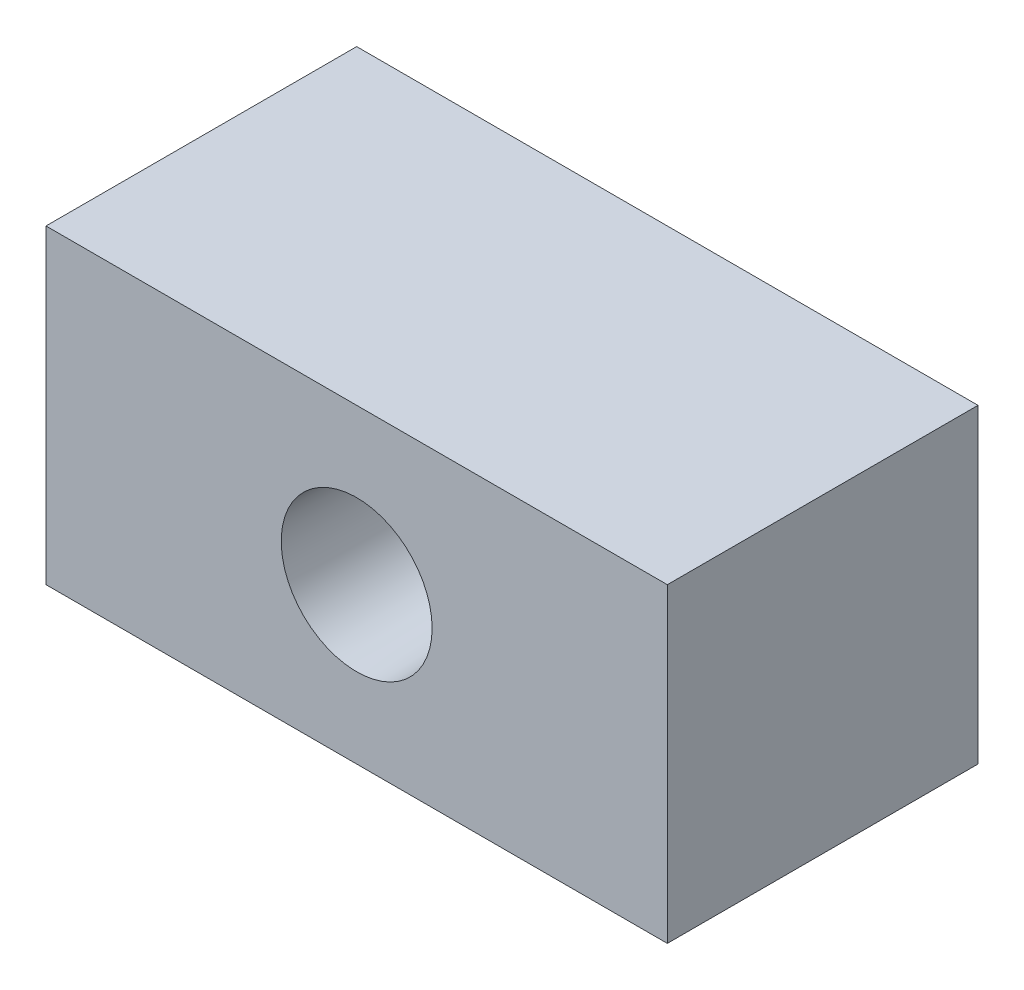
ISO-10303-21;
HEADER;
FILE_DESCRIPTION(('STEP AP214'),'2;1');
FILE_NAME('part.step','',(''),(''),'','','');
FILE_SCHEMA(('AUTOMOTIVE_DESIGN { 1 0 10303 214 1 1 1 1 }'));
ENDSEC;
DATA;
#1=APPLICATION_CONTEXT('core data for automotive mechanical design processes');
#2=APPLICATION_PROTOCOL_DEFINITION('international standard','automotive_design',2000,#1);
#3=PRODUCT_CONTEXT('',#1,'mechanical');
#4=PRODUCT('Part','Part','',(#3));
#5=PRODUCT_RELATED_PRODUCT_CATEGORY('part','',(#4));
#6=PRODUCT_DEFINITION_FORMATION('','',#4);
#7=PRODUCT_DEFINITION_CONTEXT('part definition',#1,'design');
#8=PRODUCT_DEFINITION('design','',#6,#7);
#9=PRODUCT_DEFINITION_SHAPE('','',#8);
#10=(LENGTH_UNIT() NAMED_UNIT(*) SI_UNIT(.MILLI.,.METRE.));
#11=(NAMED_UNIT(*) PLANE_ANGLE_UNIT() SI_UNIT($,.RADIAN.));
#12=(NAMED_UNIT(*) SI_UNIT($,.STERADIAN.) SOLID_ANGLE_UNIT());
#13=UNCERTAINTY_MEASURE_WITH_UNIT(LENGTH_MEASURE(1.E-05),#10,'distance_accuracy_value','');
#14=(GEOMETRIC_REPRESENTATION_CONTEXT(3) GLOBAL_UNCERTAINTY_ASSIGNED_CONTEXT((#13)) GLOBAL_UNIT_ASSIGNED_CONTEXT((#10,
#11,#12)) REPRESENTATION_CONTEXT('',''));
#15=CARTESIAN_POINT('',(0.,0.,0.));
#16=DIRECTION('',(0.,0.,1.));
#17=DIRECTION('',(1.,0.,0.));
#18=AXIS2_PLACEMENT_3D('',#15,#16,#17);
#19=CARTESIAN_POINT('',(-7.,-3.5,7.));
#20=DIRECTION('',(1.,0.,0.));
#21=DIRECTION('',(0.,0.,-1.));
#22=AXIS2_PLACEMENT_3D('',#19,#20,#21);
#23=PLANE('',#22);
#24=DIRECTION('',(0.,-1.,0.));
#25=VECTOR('',#24,1.);
#26=CARTESIAN_POINT('',(-7.,-3.5,0.));
#27=LINE('',#26,#25);
#28=CARTESIAN_POINT('',(-7.,3.5,0.));
#29=VERTEX_POINT('',#28);
#30=CARTESIAN_POINT('',(-7.,-3.5,0.));
#31=VERTEX_POINT('',#30);
#32=EDGE_CURVE('E98',#29,#31,#27,.T.);
#33=ORIENTED_EDGE('',*,*,#32,.T.);
#34=DIRECTION('',(0.,0.,-1.));
#35=VECTOR('',#34,1.);
#36=CARTESIAN_POINT('',(-7.,-3.5,7.));
#37=LINE('',#36,#35);
#38=CARTESIAN_POINT('',(-7.,-3.5,7.));
#39=VERTEX_POINT('',#38);
#40=EDGE_CURVE('E11',#39,#31,#37,.T.);
#41=ORIENTED_EDGE('',*,*,#40,.F.);
#42=DIRECTION('',(0.,-1.,0.));
#43=VECTOR('',#42,1.);
#44=CARTESIAN_POINT('',(-7.,-3.5,7.));
#45=LINE('',#44,#43);
#46=CARTESIAN_POINT('',(-7.,3.5,7.));
#47=VERTEX_POINT('',#46);
#48=EDGE_CURVE('E86',#47,#39,#45,.T.);
#49=ORIENTED_EDGE('',*,*,#48,.F.);
#50=DIRECTION('',(0.,0.,-1.));
#51=VECTOR('',#50,1.);
#52=CARTESIAN_POINT('',(-7.,3.5,7.));
#53=LINE('',#52,#51);
#54=EDGE_CURVE('E94',#47,#29,#53,.T.);
#55=ORIENTED_EDGE('',*,*,#54,.T.);
#56=EDGE_LOOP('',(#33,#41,#49,#55));
#57=FACE_BOUND('',#56,.T.);
#58=ADVANCED_FACE('F35',(#57),#23,.F.);
#59=CARTESIAN_POINT('',(7.,-3.5,7.));
#60=DIRECTION('',(0.,1.,0.));
#61=DIRECTION('',(0.,0.,1.));
#62=AXIS2_PLACEMENT_3D('',#59,#60,#61);
#63=PLANE('',#62);
#64=DIRECTION('',(1.,0.,0.));
#65=VECTOR('',#64,1.);
#66=CARTESIAN_POINT('',(7.,-3.5,0.));
#67=LINE('',#66,#65);
#68=CARTESIAN_POINT('',(7.,-3.5,0.));
#69=VERTEX_POINT('',#68);
#70=EDGE_CURVE('E90',#31,#69,#67,.T.);
#71=ORIENTED_EDGE('',*,*,#70,.T.);
#72=DIRECTION('',(0.,0.,-1.));
#73=VECTOR('',#72,1.);
#74=CARTESIAN_POINT('',(7.,-3.5,7.));
#75=LINE('',#74,#73);
#76=CARTESIAN_POINT('',(7.,-3.5,7.));
#77=VERTEX_POINT('',#76);
#78=EDGE_CURVE('E43',#77,#69,#75,.T.);
#79=ORIENTED_EDGE('',*,*,#78,.F.);
#80=DIRECTION('',(1.,0.,0.));
#81=VECTOR('',#80,1.);
#82=CARTESIAN_POINT('',(7.,-3.5,7.));
#83=LINE('',#82,#81);
#84=EDGE_CURVE('E81',#39,#77,#83,.T.);
#85=ORIENTED_EDGE('',*,*,#84,.F.);
#86=ORIENTED_EDGE('',*,*,#40,.T.);
#87=EDGE_LOOP('',(#71,#79,#85,#86));
#88=FACE_BOUND('',#87,.T.);
#89=ADVANCED_FACE('F89',(#88),#63,.F.);
#90=CARTESIAN_POINT('',(7.,-3.5,7.));
#91=DIRECTION('',(-1.,0.,0.));
#92=DIRECTION('',(0.,-1.,0.));
#93=AXIS2_PLACEMENT_3D('',#90,#91,#92);
#94=PLANE('',#93);
#95=DIRECTION('',(0.,1.,0.));
#96=VECTOR('',#95,1.);
#97=CARTESIAN_POINT('',(7.,-3.5,0.));
#98=LINE('',#97,#96);
#99=CARTESIAN_POINT('',(6.99999999999999,3.5,0.));
#100=VERTEX_POINT('',#99);
#101=EDGE_CURVE('E68',#69,#100,#98,.T.);
#102=ORIENTED_EDGE('',*,*,#101,.T.);
#103=DIRECTION('',(0.,0.,-1.));
#104=VECTOR('',#103,1.);
#105=CARTESIAN_POINT('',(6.99999999999999,3.5,7.));
#106=LINE('',#105,#104);
#107=CARTESIAN_POINT('',(6.99999999999999,3.5,7.));
#108=VERTEX_POINT('',#107);
#109=EDGE_CURVE('E91',#108,#100,#106,.T.);
#110=ORIENTED_EDGE('',*,*,#109,.F.);
#111=DIRECTION('',(0.,1.,0.));
#112=VECTOR('',#111,1.);
#113=CARTESIAN_POINT('',(7.,-3.5,7.));
#114=LINE('',#113,#112);
#115=EDGE_CURVE('E84',#77,#108,#114,.T.);
#116=ORIENTED_EDGE('',*,*,#115,.F.);
#117=ORIENTED_EDGE('',*,*,#78,.T.);
#118=EDGE_LOOP('',(#102,#110,#116,#117));
#119=FACE_BOUND('',#118,.T.);
#120=ADVANCED_FACE('F92',(#119),#94,.F.);
#121=CARTESIAN_POINT('',(6.99999999999999,3.5,7.));
#122=DIRECTION('',(0.,-1.,0.));
#123=DIRECTION('',(0.,0.,-1.));
#124=AXIS2_PLACEMENT_3D('',#121,#122,#123);
#125=PLANE('',#124);
#126=DIRECTION('',(-1.,0.,0.));
#127=VECTOR('',#126,1.);
#128=CARTESIAN_POINT('',(6.99999999999999,3.5,0.));
#129=LINE('',#128,#127);
#130=EDGE_CURVE('E74',#100,#29,#129,.T.);
#131=ORIENTED_EDGE('',*,*,#130,.T.);
#132=ORIENTED_EDGE('',*,*,#54,.F.);
#133=DIRECTION('',(-1.,0.,0.));
#134=VECTOR('',#133,1.);
#135=CARTESIAN_POINT('',(6.99999999999999,3.5,7.));
#136=LINE('',#135,#134);
#137=EDGE_CURVE('E51',#108,#47,#136,.T.);
#138=ORIENTED_EDGE('',*,*,#137,.F.);
#139=ORIENTED_EDGE('',*,*,#109,.T.);
#140=EDGE_LOOP('',(#131,#132,#138,#139));
#141=FACE_BOUND('',#140,.T.);
#142=ADVANCED_FACE('F106',(#141),#125,.F.);
#143=CARTESIAN_POINT('',(0.,0.,7.));
#144=DIRECTION('',(0.,0.,1.));
#145=DIRECTION('',(1.,0.,0.));
#146=AXIS2_PLACEMENT_3D('',#143,#144,#145);
#147=PLANE('',#146);
#148=CARTESIAN_POINT('',(0.,0.,7.));
#149=DIRECTION('',(0.,0.,1.));
#150=DIRECTION('',(1.,0.,0.));
#151=AXIS2_PLACEMENT_3D('',#148,#149,#150);
#152=CIRCLE('',#151,1.7);
#153=CARTESIAN_POINT('',(1.7,0.,7.));
#154=VERTEX_POINT('',#153);
#155=EDGE_CURVE('E114',#154,#154,#152,.T.);
#156=ORIENTED_EDGE('',*,*,#155,.F.);
#157=EDGE_LOOP('',(#156));
#158=FACE_BOUND('',#157,.T.);
#159=ORIENTED_EDGE('',*,*,#48,.T.);
#160=ORIENTED_EDGE('',*,*,#84,.T.);
#161=ORIENTED_EDGE('',*,*,#115,.T.);
#162=ORIENTED_EDGE('',*,*,#137,.T.);
#163=EDGE_LOOP('',(#159,#160,#161,#162));
#164=FACE_BOUND('',#163,.T.);
#165=ADVANCED_FACE('F82',(#158,#164),#147,.T.);
#166=CARTESIAN_POINT('',(0.,0.,0.));
#167=DIRECTION('',(0.,0.,1.));
#168=DIRECTION('',(1.,0.,0.));
#169=AXIS2_PLACEMENT_3D('',#166,#167,#168);
#170=PLANE('',#169);
#171=ORIENTED_EDGE('',*,*,#32,.F.);
#172=ORIENTED_EDGE('',*,*,#130,.F.);
#173=ORIENTED_EDGE('',*,*,#101,.F.);
#174=ORIENTED_EDGE('',*,*,#70,.F.);
#175=EDGE_LOOP('',(#171,#172,#173,#174));
#176=FACE_BOUND('',#175,.T.);
#177=ADVANCED_FACE('F109',(#176),#170,.F.);
#178=CARTESIAN_POINT('',(0.,0.,7.));
#179=DIRECTION('',(0.,0.,1.));
#180=DIRECTION('',(1.,0.,0.));
#181=AXIS2_PLACEMENT_3D('',#178,#179,#180);
#182=CONICAL_SURFACE('',#181,1.7,0.0349065850398866);
#183=CARTESIAN_POINT('',(0.,0.,1.));
#184=DIRECTION('',(0.,0.,1.));
#185=DIRECTION('',(1.,0.,0.));
#186=AXIS2_PLACEMENT_3D('',#183,#184,#185);
#187=CIRCLE('',#186,1.49047538304951);
#188=CARTESIAN_POINT('',(1.49047538304951,0.,1.));
#189=VERTEX_POINT('',#188);
#190=EDGE_CURVE('E101',#189,#189,#187,.T.);
#191=ORIENTED_EDGE('',*,*,#190,.F.);
#192=EDGE_LOOP('',(#191));
#193=FACE_BOUND('',#192,.T.);
#194=ORIENTED_EDGE('',*,*,#155,.T.);
#195=EDGE_LOOP('',(#194));
#196=FACE_BOUND('',#195,.T.);
#197=ADVANCED_FACE('F118',(#193,#196),#182,.F.);
#198=CARTESIAN_POINT('',(0.,0.,1.));
#199=DIRECTION('',(0.,0.,1.));
#200=DIRECTION('',(1.,0.,0.));
#201=AXIS2_PLACEMENT_3D('',#198,#199,#200);
#202=PLANE('',#201);
#203=ORIENTED_EDGE('',*,*,#190,.T.);
#204=EDGE_LOOP('',(#203));
#205=FACE_BOUND('',#204,.T.);
#206=ADVANCED_FACE('F162',(#205),#202,.T.);
#207=CLOSED_SHELL('',(#58,#89,#120,#142,#165,#177,#197,#206));
#208=MANIFOLD_SOLID_BREP('B2',#207);
#209=ADVANCED_BREP_SHAPE_REPRESENTATION('',(#18,#208),#14);
#210=SHAPE_DEFINITION_REPRESENTATION(#9,#209);
ENDSEC;
END-ISO-10303-21;
